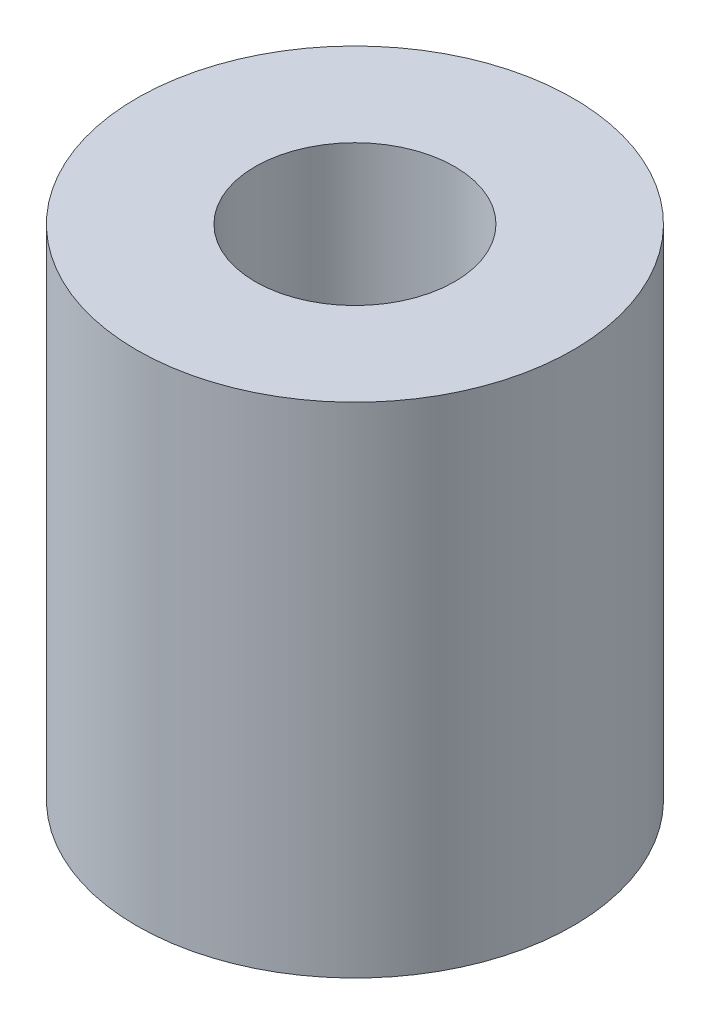
ISO-10303-21;
HEADER;
FILE_DESCRIPTION(('STEP AP214'),'2;1');
FILE_NAME('part.step','',(''),(''),'','','');
FILE_SCHEMA(('AUTOMOTIVE_DESIGN { 1 0 10303 214 1 1 1 1 }'));
ENDSEC;
DATA;
#1=APPLICATION_CONTEXT('core data for automotive mechanical design processes');
#2=APPLICATION_PROTOCOL_DEFINITION('international standard','automotive_design',2000,#1);
#3=PRODUCT_CONTEXT('',#1,'mechanical');
#4=PRODUCT('Part','Part','',(#3));
#5=PRODUCT_RELATED_PRODUCT_CATEGORY('part','',(#4));
#6=PRODUCT_DEFINITION_FORMATION('','',#4);
#7=PRODUCT_DEFINITION_CONTEXT('part definition',#1,'design');
#8=PRODUCT_DEFINITION('design','',#6,#7);
#9=PRODUCT_DEFINITION_SHAPE('','',#8);
#10=(LENGTH_UNIT() NAMED_UNIT(*) SI_UNIT(.MILLI.,.METRE.));
#11=(NAMED_UNIT(*) PLANE_ANGLE_UNIT() SI_UNIT($,.RADIAN.));
#12=(NAMED_UNIT(*) SI_UNIT($,.STERADIAN.) SOLID_ANGLE_UNIT());
#13=UNCERTAINTY_MEASURE_WITH_UNIT(LENGTH_MEASURE(1.E-05),#10,'distance_accuracy_value','');
#14=(GEOMETRIC_REPRESENTATION_CONTEXT(3) GLOBAL_UNCERTAINTY_ASSIGNED_CONTEXT((#13)) GLOBAL_UNIT_ASSIGNED_CONTEXT((#10,
#11,#12)) REPRESENTATION_CONTEXT('',''));
#15=CARTESIAN_POINT('',(0.,0.,0.));
#16=DIRECTION('',(0.,0.,1.));
#17=DIRECTION('',(1.,0.,0.));
#18=AXIS2_PLACEMENT_3D('',#15,#16,#17);
#19=CARTESIAN_POINT('',(0.,4.,0.));
#20=DIRECTION('',(0.,-1.,0.));
#21=DIRECTION('',(0.,0.,-1.));
#22=AXIS2_PLACEMENT_3D('',#19,#20,#21);
#23=CYLINDRICAL_SURFACE('',#22,1.75);
#24=CARTESIAN_POINT('',(0.,4.,0.));
#25=DIRECTION('',(0.,1.,0.));
#26=DIRECTION('',(0.,0.,1.));
#27=AXIS2_PLACEMENT_3D('',#24,#25,#26);
#28=CIRCLE('',#27,1.75);
#29=CARTESIAN_POINT('',(0.,4.,1.75));
#30=VERTEX_POINT('',#29);
#31=EDGE_CURVE('E10',#30,#30,#28,.T.);
#32=ORIENTED_EDGE('',*,*,#31,.F.);
#33=EDGE_LOOP('',(#32));
#34=FACE_BOUND('',#33,.T.);
#35=CARTESIAN_POINT('',(0.,0.,0.));
#36=DIRECTION('',(0.,1.,0.));
#37=DIRECTION('',(0.,0.,1.));
#38=AXIS2_PLACEMENT_3D('',#35,#36,#37);
#39=CIRCLE('',#38,1.75);
#40=CARTESIAN_POINT('',(0.,0.,1.75));
#41=VERTEX_POINT('',#40);
#42=EDGE_CURVE('E37',#41,#41,#39,.T.);
#43=ORIENTED_EDGE('',*,*,#42,.T.);
#44=EDGE_LOOP('',(#43));
#45=FACE_BOUND('',#44,.T.);
#46=ADVANCED_FACE('F34',(#34,#45),#23,.T.);
#47=CARTESIAN_POINT('',(0.,4.,0.));
#48=DIRECTION('',(0.,1.,0.));
#49=DIRECTION('',(0.,0.,1.));
#50=AXIS2_PLACEMENT_3D('',#47,#48,#49);
#51=PLANE('',#50);
#52=CARTESIAN_POINT('',(0.,4.,0.));
#53=DIRECTION('',(0.,1.,0.));
#54=DIRECTION('',(0.,0.,1.));
#55=AXIS2_PLACEMENT_3D('',#52,#53,#54);
#56=CIRCLE('',#55,0.799999999999988);
#57=CARTESIAN_POINT('',(0.,4.,0.799999999999988));
#58=VERTEX_POINT('',#57);
#59=EDGE_CURVE('E48',#58,#58,#56,.T.);
#60=ORIENTED_EDGE('',*,*,#59,.F.);
#61=EDGE_LOOP('',(#60));
#62=FACE_BOUND('',#61,.T.);
#63=ORIENTED_EDGE('',*,*,#31,.T.);
#64=EDGE_LOOP('',(#63));
#65=FACE_BOUND('',#64,.T.);
#66=ADVANCED_FACE('F54',(#62,#65),#51,.T.);
#67=CARTESIAN_POINT('',(0.,0.,0.));
#68=DIRECTION('',(0.,1.,0.));
#69=DIRECTION('',(0.,0.,1.));
#70=AXIS2_PLACEMENT_3D('',#67,#68,#69);
#71=PLANE('',#70);
#72=CARTESIAN_POINT('',(0.,0.,0.));
#73=DIRECTION('',(0.,1.,0.));
#74=DIRECTION('',(0.,0.,1.));
#75=AXIS2_PLACEMENT_3D('',#72,#73,#74);
#76=CIRCLE('',#75,0.799999999999999);
#77=CARTESIAN_POINT('',(0.,0.,0.799999999999999));
#78=VERTEX_POINT('',#77);
#79=EDGE_CURVE('E44',#78,#78,#76,.T.);
#80=ORIENTED_EDGE('',*,*,#79,.T.);
#81=EDGE_LOOP('',(#80));
#82=FACE_BOUND('',#81,.T.);
#83=ORIENTED_EDGE('',*,*,#42,.F.);
#84=EDGE_LOOP('',(#83));
#85=FACE_BOUND('',#84,.T.);
#86=ADVANCED_FACE('F56',(#82,#85),#71,.F.);
#87=CARTESIAN_POINT('',(0.,4.,0.));
#88=DIRECTION('',(0.,1.,0.));
#89=DIRECTION('',(0.,0.,1.));
#90=AXIS2_PLACEMENT_3D('',#87,#88,#89);
#91=CYLINDRICAL_SURFACE('',#90,0.799999999999993);
#92=ORIENTED_EDGE('',*,*,#79,.F.);
#93=EDGE_LOOP('',(#92));
#94=FACE_BOUND('',#93,.T.);
#95=ORIENTED_EDGE('',*,*,#59,.T.);
#96=EDGE_LOOP('',(#95));
#97=FACE_BOUND('',#96,.T.);
#98=ADVANCED_FACE('F52',(#94,#97),#91,.F.);
#99=CLOSED_SHELL('',(#46,#66,#86,#98));
#100=MANIFOLD_SOLID_BREP('B2',#99);
#101=ADVANCED_BREP_SHAPE_REPRESENTATION('',(#18,#100),#14);
#102=SHAPE_DEFINITION_REPRESENTATION(#9,#101);
ENDSEC;
END-ISO-10303-21;
